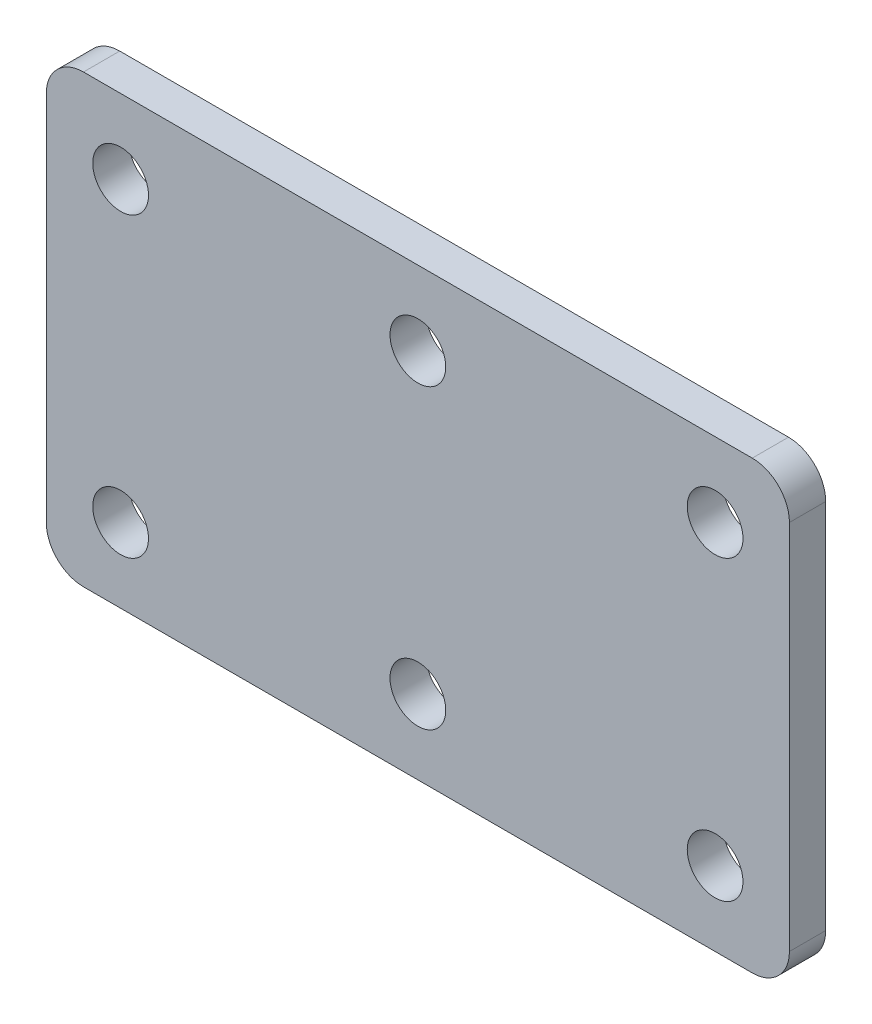
ISO-10303-21;
HEADER;
FILE_DESCRIPTION(('STEP AP214'),'2;1');
FILE_NAME('part.step','',(''),(''),'','','');
FILE_SCHEMA(('AUTOMOTIVE_DESIGN { 1 0 10303 214 1 1 1 1 }'));
ENDSEC;
DATA;
#1=APPLICATION_CONTEXT('core data for automotive mechanical design processes');
#2=APPLICATION_PROTOCOL_DEFINITION('international standard','automotive_design',2000,#1);
#3=PRODUCT_CONTEXT('',#1,'mechanical');
#4=PRODUCT('Part','Part','',(#3));
#5=PRODUCT_RELATED_PRODUCT_CATEGORY('part','',(#4));
#6=PRODUCT_DEFINITION_FORMATION('','',#4);
#7=PRODUCT_DEFINITION_CONTEXT('part definition',#1,'design');
#8=PRODUCT_DEFINITION('design','',#6,#7);
#9=PRODUCT_DEFINITION_SHAPE('','',#8);
#10=(LENGTH_UNIT() NAMED_UNIT(*) SI_UNIT(.MILLI.,.METRE.));
#11=(NAMED_UNIT(*) PLANE_ANGLE_UNIT() SI_UNIT($,.RADIAN.));
#12=(NAMED_UNIT(*) SI_UNIT($,.STERADIAN.) SOLID_ANGLE_UNIT());
#13=UNCERTAINTY_MEASURE_WITH_UNIT(LENGTH_MEASURE(1.E-05),#10,'distance_accuracy_value','');
#14=(GEOMETRIC_REPRESENTATION_CONTEXT(3) GLOBAL_UNCERTAINTY_ASSIGNED_CONTEXT((#13)) GLOBAL_UNIT_ASSIGNED_CONTEXT((#10,
#11,#12)) REPRESENTATION_CONTEXT('',''));
#15=CARTESIAN_POINT('',(0.,0.,0.));
#16=DIRECTION('',(0.,0.,1.));
#17=DIRECTION('',(1.,0.,0.));
#18=AXIS2_PLACEMENT_3D('',#15,#16,#17);
#19=CARTESIAN_POINT('',(0.,0.,3.0988));
#20=DIRECTION('',(0.,0.,1.));
#21=DIRECTION('',(1.,0.,0.));
#22=AXIS2_PLACEMENT_3D('',#19,#20,#21);
#23=PLANE('',#22);
#24=CARTESIAN_POINT('',(-25.4,-12.7,3.0988));
#25=DIRECTION('',(0.,0.,1.));
#26=DIRECTION('',(-1.,0.,0.));
#27=AXIS2_PLACEMENT_3D('',#24,#25,#26);
#28=CIRCLE('',#27,2.38125);
#29=CARTESIAN_POINT('',(-27.78125,-12.7,3.0988));
#30=VERTEX_POINT('',#29);
#31=EDGE_CURVE('E174',#30,#30,#28,.T.);
#32=ORIENTED_EDGE('',*,*,#31,.F.);
#33=EDGE_LOOP('',(#32));
#34=FACE_BOUND('',#33,.T.);
#35=CARTESIAN_POINT('',(25.3999999999999,-12.7,3.0988));
#36=DIRECTION('',(0.,0.,1.));
#37=DIRECTION('',(-1.,0.,0.));
#38=AXIS2_PLACEMENT_3D('',#35,#36,#37);
#39=CIRCLE('',#38,2.38125);
#40=CARTESIAN_POINT('',(23.0187499999999,-12.7,3.0988));
#41=VERTEX_POINT('',#40);
#42=EDGE_CURVE('E187',#41,#41,#39,.T.);
#43=ORIENTED_EDGE('',*,*,#42,.F.);
#44=EDGE_LOOP('',(#43));
#45=FACE_BOUND('',#44,.T.);
#46=CARTESIAN_POINT('',(0.,12.7,3.0988));
#47=DIRECTION('',(0.,0.,1.));
#48=DIRECTION('',(1.,0.,0.));
#49=AXIS2_PLACEMENT_3D('',#46,#47,#48);
#50=CIRCLE('',#49,2.38125);
#51=CARTESIAN_POINT('',(2.38125000000001,12.7,3.0988));
#52=VERTEX_POINT('',#51);
#53=EDGE_CURVE('E199',#52,#52,#50,.T.);
#54=ORIENTED_EDGE('',*,*,#53,.F.);
#55=EDGE_LOOP('',(#54));
#56=FACE_BOUND('',#55,.T.);
#57=CARTESIAN_POINT('',(-25.4,12.7,3.0988));
#58=DIRECTION('',(0.,0.,1.));
#59=DIRECTION('',(1.,0.,0.));
#60=AXIS2_PLACEMENT_3D('',#57,#58,#59);
#61=CIRCLE('',#60,2.38125);
#62=CARTESIAN_POINT('',(-23.01875,12.7,3.0988));
#63=VERTEX_POINT('',#62);
#64=EDGE_CURVE('E126',#63,#63,#61,.T.);
#65=ORIENTED_EDGE('',*,*,#64,.F.);
#66=EDGE_LOOP('',(#65));
#67=FACE_BOUND('',#66,.T.);
#68=CARTESIAN_POINT('',(25.4,12.7,3.0988));
#69=DIRECTION('',(0.,0.,1.));
#70=DIRECTION('',(1.,0.,0.));
#71=AXIS2_PLACEMENT_3D('',#68,#69,#70);
#72=CIRCLE('',#71,2.38125);
#73=CARTESIAN_POINT('',(27.78125,12.7,3.0988));
#74=VERTEX_POINT('',#73);
#75=EDGE_CURVE('E193',#74,#74,#72,.T.);
#76=ORIENTED_EDGE('',*,*,#75,.F.);
#77=EDGE_LOOP('',(#76));
#78=FACE_BOUND('',#77,.T.);
#79=CARTESIAN_POINT('',(0.,-12.7,3.0988));
#80=DIRECTION('',(0.,0.,1.));
#81=DIRECTION('',(-1.,0.,0.));
#82=AXIS2_PLACEMENT_3D('',#79,#80,#81);
#83=CIRCLE('',#82,2.38125);
#84=CARTESIAN_POINT('',(-2.38125000000002,-12.7,3.0988));
#85=VERTEX_POINT('',#84);
#86=EDGE_CURVE('E181',#85,#85,#83,.T.);
#87=ORIENTED_EDGE('',*,*,#86,.F.);
#88=EDGE_LOOP('',(#87));
#89=FACE_BOUND('',#88,.T.);
#90=DIRECTION('',(1.,0.,0.));
#91=VECTOR('',#90,1.);
#92=CARTESIAN_POINT('',(-31.75,-19.05,3.0988));
#93=LINE('',#92,#91);
#94=CARTESIAN_POINT('',(-28.575,-19.05,3.0988));
#95=VERTEX_POINT('',#94);
#96=CARTESIAN_POINT('',(28.575,-19.05,3.0988));
#97=VERTEX_POINT('',#96);
#98=EDGE_CURVE('E104',#95,#97,#93,.T.);
#99=ORIENTED_EDGE('',*,*,#98,.T.);
#100=CARTESIAN_POINT('',(28.575,-15.875,3.0988));
#101=DIRECTION('',(0.,0.,1.));
#102=DIRECTION('',(1.,0.,0.));
#103=AXIS2_PLACEMENT_3D('',#100,#101,#102);
#104=CIRCLE('',#103,3.175);
#105=CARTESIAN_POINT('',(31.75,-15.875,3.0988));
#106=VERTEX_POINT('',#105);
#107=EDGE_CURVE('E136',#97,#106,#104,.T.);
#108=ORIENTED_EDGE('',*,*,#107,.T.);
#109=DIRECTION('',(0.,1.,0.));
#110=VECTOR('',#109,1.);
#111=CARTESIAN_POINT('',(31.75,-19.05,3.0988));
#112=LINE('',#111,#110);
#113=CARTESIAN_POINT('',(31.75,15.875,3.0988));
#114=VERTEX_POINT('',#113);
#115=EDGE_CURVE('E168',#106,#114,#112,.T.);
#116=ORIENTED_EDGE('',*,*,#115,.T.);
#117=CARTESIAN_POINT('',(28.575,15.875,3.0988));
#118=DIRECTION('',(0.,0.,1.));
#119=DIRECTION('',(1.,0.,0.));
#120=AXIS2_PLACEMENT_3D('',#117,#118,#119);
#121=CIRCLE('',#120,3.175);
#122=CARTESIAN_POINT('',(28.575,19.05,3.0988));
#123=VERTEX_POINT('',#122);
#124=EDGE_CURVE('E110',#114,#123,#121,.T.);
#125=ORIENTED_EDGE('',*,*,#124,.T.);
#126=DIRECTION('',(-1.,0.,0.));
#127=VECTOR('',#126,1.);
#128=CARTESIAN_POINT('',(31.75,19.05,3.0988));
#129=LINE('',#128,#127);
#130=CARTESIAN_POINT('',(-28.575,19.05,3.0988));
#131=VERTEX_POINT('',#130);
#132=EDGE_CURVE('E166',#123,#131,#129,.T.);
#133=ORIENTED_EDGE('',*,*,#132,.T.);
#134=CARTESIAN_POINT('',(-28.575,15.875,3.0988));
#135=DIRECTION('',(0.,0.,1.));
#136=DIRECTION('',(1.,0.,0.));
#137=AXIS2_PLACEMENT_3D('',#134,#135,#136);
#138=CIRCLE('',#137,3.175);
#139=CARTESIAN_POINT('',(-31.75,15.875,3.0988));
#140=VERTEX_POINT('',#139);
#141=EDGE_CURVE('E111',#131,#140,#138,.T.);
#142=ORIENTED_EDGE('',*,*,#141,.T.);
#143=DIRECTION('',(0.,-1.,0.));
#144=VECTOR('',#143,1.);
#145=CARTESIAN_POINT('',(-31.75,19.05,3.0988));
#146=LINE('',#145,#144);
#147=CARTESIAN_POINT('',(-31.75,-15.875,3.0988));
#148=VERTEX_POINT('',#147);
#149=EDGE_CURVE('E106',#140,#148,#146,.T.);
#150=ORIENTED_EDGE('',*,*,#149,.T.);
#151=CARTESIAN_POINT('',(-28.575,-15.875,3.0988));
#152=DIRECTION('',(0.,0.,1.));
#153=DIRECTION('',(1.,0.,0.));
#154=AXIS2_PLACEMENT_3D('',#151,#152,#153);
#155=CIRCLE('',#154,3.175);
#156=EDGE_CURVE('E102',#148,#95,#155,.T.);
#157=ORIENTED_EDGE('',*,*,#156,.T.);
#158=EDGE_LOOP('',(#99,#108,#116,#125,#133,#142,#150,#157));
#159=FACE_BOUND('',#158,.T.);
#160=ADVANCED_FACE('F35',(#34,#45,#56,#67,#78,#89,#159),#23,.T.);
#161=CARTESIAN_POINT('',(0.,0.,0.));
#162=DIRECTION('',(0.,0.,1.));
#163=DIRECTION('',(1.,0.,0.));
#164=AXIS2_PLACEMENT_3D('',#161,#162,#163);
#165=PLANE('',#164);
#166=CARTESIAN_POINT('',(-25.4,-12.7,0.));
#167=DIRECTION('',(0.,0.,1.));
#168=DIRECTION('',(-1.,0.,0.));
#169=AXIS2_PLACEMENT_3D('',#166,#167,#168);
#170=CIRCLE('',#169,2.38125);
#171=CARTESIAN_POINT('',(-27.78125,-12.7,0.));
#172=VERTEX_POINT('',#171);
#173=EDGE_CURVE('E178',#172,#172,#170,.T.);
#174=ORIENTED_EDGE('',*,*,#173,.T.);
#175=EDGE_LOOP('',(#174));
#176=FACE_BOUND('',#175,.T.);
#177=CARTESIAN_POINT('',(0.,-12.7,0.));
#178=DIRECTION('',(0.,0.,1.));
#179=DIRECTION('',(-1.,0.,0.));
#180=AXIS2_PLACEMENT_3D('',#177,#178,#179);
#181=CIRCLE('',#180,2.38125);
#182=CARTESIAN_POINT('',(-2.38125000000002,-12.7,0.));
#183=VERTEX_POINT('',#182);
#184=EDGE_CURVE('E177',#183,#183,#181,.T.);
#185=ORIENTED_EDGE('',*,*,#184,.T.);
#186=EDGE_LOOP('',(#185));
#187=FACE_BOUND('',#186,.T.);
#188=CARTESIAN_POINT('',(25.3999999999999,-12.7,0.));
#189=DIRECTION('',(0.,0.,1.));
#190=DIRECTION('',(-1.,0.,0.));
#191=AXIS2_PLACEMENT_3D('',#188,#189,#190);
#192=CIRCLE('',#191,2.38125);
#193=CARTESIAN_POINT('',(23.0187499999999,-12.7,0.));
#194=VERTEX_POINT('',#193);
#195=EDGE_CURVE('E184',#194,#194,#192,.T.);
#196=ORIENTED_EDGE('',*,*,#195,.T.);
#197=EDGE_LOOP('',(#196));
#198=FACE_BOUND('',#197,.T.);
#199=CARTESIAN_POINT('',(25.4,12.7,0.));
#200=DIRECTION('',(0.,0.,1.));
#201=DIRECTION('',(1.,0.,0.));
#202=AXIS2_PLACEMENT_3D('',#199,#200,#201);
#203=CIRCLE('',#202,2.38125);
#204=CARTESIAN_POINT('',(27.78125,12.7,0.));
#205=VERTEX_POINT('',#204);
#206=EDGE_CURVE('E190',#205,#205,#203,.T.);
#207=ORIENTED_EDGE('',*,*,#206,.T.);
#208=EDGE_LOOP('',(#207));
#209=FACE_BOUND('',#208,.T.);
#210=CARTESIAN_POINT('',(0.,12.7,0.));
#211=DIRECTION('',(0.,0.,1.));
#212=DIRECTION('',(1.,0.,0.));
#213=AXIS2_PLACEMENT_3D('',#210,#211,#212);
#214=CIRCLE('',#213,2.38125);
#215=CARTESIAN_POINT('',(2.38125000000001,12.7,0.));
#216=VERTEX_POINT('',#215);
#217=EDGE_CURVE('E196',#216,#216,#214,.T.);
#218=ORIENTED_EDGE('',*,*,#217,.T.);
#219=EDGE_LOOP('',(#218));
#220=FACE_BOUND('',#219,.T.);
#221=CARTESIAN_POINT('',(-25.4,12.7,0.));
#222=DIRECTION('',(0.,0.,1.));
#223=DIRECTION('',(1.,0.,0.));
#224=AXIS2_PLACEMENT_3D('',#221,#222,#223);
#225=CIRCLE('',#224,2.38125);
#226=CARTESIAN_POINT('',(-23.01875,12.7,0.));
#227=VERTEX_POINT('',#226);
#228=EDGE_CURVE('E130',#227,#227,#225,.T.);
#229=ORIENTED_EDGE('',*,*,#228,.T.);
#230=EDGE_LOOP('',(#229));
#231=FACE_BOUND('',#230,.T.);
#232=DIRECTION('',(0.,1.,0.));
#233=VECTOR('',#232,1.);
#234=CARTESIAN_POINT('',(31.75,-19.05,0.));
#235=LINE('',#234,#233);
#236=CARTESIAN_POINT('',(31.75,-15.875,0.));
#237=VERTEX_POINT('',#236);
#238=CARTESIAN_POINT('',(31.75,15.875,0.));
#239=VERTEX_POINT('',#238);
#240=EDGE_CURVE('E121',#237,#239,#235,.T.);
#241=ORIENTED_EDGE('',*,*,#240,.F.);
#242=CARTESIAN_POINT('',(28.575,-15.875,0.));
#243=DIRECTION('',(0.,0.,1.));
#244=DIRECTION('',(1.,0.,0.));
#245=AXIS2_PLACEMENT_3D('',#242,#243,#244);
#246=CIRCLE('',#245,3.175);
#247=CARTESIAN_POINT('',(28.575,-19.05,0.));
#248=VERTEX_POINT('',#247);
#249=EDGE_CURVE('E147',#237,#248,#246,.F.);
#250=ORIENTED_EDGE('',*,*,#249,.T.);
#251=DIRECTION('',(1.,0.,0.));
#252=VECTOR('',#251,1.);
#253=CARTESIAN_POINT('',(-31.75,-19.05,0.));
#254=LINE('',#253,#252);
#255=CARTESIAN_POINT('',(-28.575,-19.05,0.));
#256=VERTEX_POINT('',#255);
#257=EDGE_CURVE('E160',#256,#248,#254,.T.);
#258=ORIENTED_EDGE('',*,*,#257,.F.);
#259=CARTESIAN_POINT('',(-28.575,-15.875,0.));
#260=DIRECTION('',(0.,0.,1.));
#261=DIRECTION('',(1.,0.,0.));
#262=AXIS2_PLACEMENT_3D('',#259,#260,#261);
#263=CIRCLE('',#262,3.175);
#264=CARTESIAN_POINT('',(-31.75,-15.875,0.));
#265=VERTEX_POINT('',#264);
#266=EDGE_CURVE('E125',#256,#265,#263,.F.);
#267=ORIENTED_EDGE('',*,*,#266,.T.);
#268=DIRECTION('',(0.,-1.,0.));
#269=VECTOR('',#268,1.);
#270=CARTESIAN_POINT('',(-31.75,19.05,0.));
#271=LINE('',#270,#269);
#272=CARTESIAN_POINT('',(-31.75,15.875,0.));
#273=VERTEX_POINT('',#272);
#274=EDGE_CURVE('E156',#273,#265,#271,.T.);
#275=ORIENTED_EDGE('',*,*,#274,.F.);
#276=CARTESIAN_POINT('',(-28.575,15.875,0.));
#277=DIRECTION('',(0.,0.,1.));
#278=DIRECTION('',(1.,0.,0.));
#279=AXIS2_PLACEMENT_3D('',#276,#277,#278);
#280=CIRCLE('',#279,3.175);
#281=CARTESIAN_POINT('',(-28.575,19.05,0.));
#282=VERTEX_POINT('',#281);
#283=EDGE_CURVE('E50',#273,#282,#280,.F.);
#284=ORIENTED_EDGE('',*,*,#283,.T.);
#285=DIRECTION('',(-1.,0.,0.));
#286=VECTOR('',#285,1.);
#287=CARTESIAN_POINT('',(31.75,19.05,0.));
#288=LINE('',#287,#286);
#289=CARTESIAN_POINT('',(28.575,19.05,0.));
#290=VERTEX_POINT('',#289);
#291=EDGE_CURVE('E161',#290,#282,#288,.T.);
#292=ORIENTED_EDGE('',*,*,#291,.F.);
#293=CARTESIAN_POINT('',(28.575,15.875,0.));
#294=DIRECTION('',(0.,0.,1.));
#295=DIRECTION('',(1.,0.,0.));
#296=AXIS2_PLACEMENT_3D('',#293,#294,#295);
#297=CIRCLE('',#296,3.175);
#298=EDGE_CURVE('E145',#290,#239,#297,.F.);
#299=ORIENTED_EDGE('',*,*,#298,.T.);
#300=EDGE_LOOP('',(#241,#250,#258,#267,#275,#284,#292,#299));
#301=FACE_BOUND('',#300,.T.);
#302=ADVANCED_FACE('F159',(#176,#187,#198,#209,#220,#231,#301),#165,.F.);
#303=CARTESIAN_POINT('',(-25.4,12.7,3.0988));
#304=DIRECTION('',(0.,0.,-1.));
#305=DIRECTION('',(-1.,0.,0.));
#306=AXIS2_PLACEMENT_3D('',#303,#304,#305);
#307=CYLINDRICAL_SURFACE('',#306,2.38125);
#308=ORIENTED_EDGE('',*,*,#64,.T.);
#309=EDGE_LOOP('',(#308));
#310=FACE_BOUND('',#309,.T.);
#311=ORIENTED_EDGE('',*,*,#228,.F.);
#312=EDGE_LOOP('',(#311));
#313=FACE_BOUND('',#312,.T.);
#314=ADVANCED_FACE('F210',(#310,#313),#307,.F.);
#315=CARTESIAN_POINT('',(0.,12.7,3.0988));
#316=DIRECTION('',(0.,0.,-1.));
#317=DIRECTION('',(-1.,0.,0.));
#318=AXIS2_PLACEMENT_3D('',#315,#316,#317);
#319=CYLINDRICAL_SURFACE('',#318,2.38125);
#320=ORIENTED_EDGE('',*,*,#53,.T.);
#321=EDGE_LOOP('',(#320));
#322=FACE_BOUND('',#321,.T.);
#323=ORIENTED_EDGE('',*,*,#217,.F.);
#324=EDGE_LOOP('',(#323));
#325=FACE_BOUND('',#324,.T.);
#326=ADVANCED_FACE('F207',(#322,#325),#319,.F.);
#327=CARTESIAN_POINT('',(25.4,12.7,3.0988));
#328=DIRECTION('',(0.,0.,-1.));
#329=DIRECTION('',(-1.,0.,0.));
#330=AXIS2_PLACEMENT_3D('',#327,#328,#329);
#331=CYLINDRICAL_SURFACE('',#330,2.38125);
#332=ORIENTED_EDGE('',*,*,#75,.T.);
#333=EDGE_LOOP('',(#332));
#334=FACE_BOUND('',#333,.T.);
#335=ORIENTED_EDGE('',*,*,#206,.F.);
#336=EDGE_LOOP('',(#335));
#337=FACE_BOUND('',#336,.T.);
#338=ADVANCED_FACE('F209',(#334,#337),#331,.F.);
#339=CARTESIAN_POINT('',(25.3999999999999,-12.7,3.0988));
#340=DIRECTION('',(0.,0.,-1.));
#341=DIRECTION('',(-1.,0.,0.));
#342=AXIS2_PLACEMENT_3D('',#339,#340,#341);
#343=CYLINDRICAL_SURFACE('',#342,2.38125);
#344=ORIENTED_EDGE('',*,*,#42,.T.);
#345=EDGE_LOOP('',(#344));
#346=FACE_BOUND('',#345,.T.);
#347=ORIENTED_EDGE('',*,*,#195,.F.);
#348=EDGE_LOOP('',(#347));
#349=FACE_BOUND('',#348,.T.);
#350=ADVANCED_FACE('F217',(#346,#349),#343,.F.);
#351=CARTESIAN_POINT('',(0.,-12.7,3.0988));
#352=DIRECTION('',(0.,0.,-1.));
#353=DIRECTION('',(-1.,0.,0.));
#354=AXIS2_PLACEMENT_3D('',#351,#352,#353);
#355=CYLINDRICAL_SURFACE('',#354,2.38125);
#356=ORIENTED_EDGE('',*,*,#86,.T.);
#357=EDGE_LOOP('',(#356));
#358=FACE_BOUND('',#357,.T.);
#359=ORIENTED_EDGE('',*,*,#184,.F.);
#360=EDGE_LOOP('',(#359));
#361=FACE_BOUND('',#360,.T.);
#362=ADVANCED_FACE('F308',(#358,#361),#355,.F.);
#363=CARTESIAN_POINT('',(-25.4,-12.7,3.0988));
#364=DIRECTION('',(0.,0.,-1.));
#365=DIRECTION('',(-1.,0.,0.));
#366=AXIS2_PLACEMENT_3D('',#363,#364,#365);
#367=CYLINDRICAL_SURFACE('',#366,2.38125);
#368=ORIENTED_EDGE('',*,*,#31,.T.);
#369=EDGE_LOOP('',(#368));
#370=FACE_BOUND('',#369,.T.);
#371=ORIENTED_EDGE('',*,*,#173,.F.);
#372=EDGE_LOOP('',(#371));
#373=FACE_BOUND('',#372,.T.);
#374=ADVANCED_FACE('F289',(#370,#373),#367,.F.);
#375=CARTESIAN_POINT('',(31.75,-19.05,0.));
#376=DIRECTION('',(1.,0.,0.));
#377=DIRECTION('',(0.,0.,-1.));
#378=AXIS2_PLACEMENT_3D('',#375,#376,#377);
#379=PLANE('',#378);
#380=ORIENTED_EDGE('',*,*,#115,.F.);
#381=DIRECTION('',(0.,0.,1.));
#382=VECTOR('',#381,1.);
#383=CARTESIAN_POINT('',(31.75,-15.875,0.));
#384=LINE('',#383,#382);
#385=EDGE_CURVE('E141',#106,#237,#384,.F.);
#386=ORIENTED_EDGE('',*,*,#385,.T.);
#387=ORIENTED_EDGE('',*,*,#240,.T.);
#388=DIRECTION('',(0.,0.,1.));
#389=VECTOR('',#388,1.);
#390=CARTESIAN_POINT('',(31.75,15.875,0.));
#391=LINE('',#390,#389);
#392=EDGE_CURVE('E138',#239,#114,#391,.T.);
#393=ORIENTED_EDGE('',*,*,#392,.T.);
#394=EDGE_LOOP('',(#380,#386,#387,#393));
#395=FACE_BOUND('',#394,.T.);
#396=ADVANCED_FACE('F282',(#395),#379,.T.);
#397=CARTESIAN_POINT('',(-31.75,-19.05,0.));
#398=DIRECTION('',(0.,-1.,0.));
#399=DIRECTION('',(0.,0.,-1.));
#400=AXIS2_PLACEMENT_3D('',#397,#398,#399);
#401=PLANE('',#400);
#402=ORIENTED_EDGE('',*,*,#257,.T.);
#403=DIRECTION('',(0.,0.,1.));
#404=VECTOR('',#403,1.);
#405=CARTESIAN_POINT('',(28.575,-19.05,0.));
#406=LINE('',#405,#404);
#407=EDGE_CURVE('E120',#248,#97,#406,.T.);
#408=ORIENTED_EDGE('',*,*,#407,.T.);
#409=ORIENTED_EDGE('',*,*,#98,.F.);
#410=DIRECTION('',(0.,0.,1.));
#411=VECTOR('',#410,1.);
#412=CARTESIAN_POINT('',(-28.575,-19.05,0.));
#413=LINE('',#412,#411);
#414=EDGE_CURVE('E117',#95,#256,#413,.F.);
#415=ORIENTED_EDGE('',*,*,#414,.T.);
#416=EDGE_LOOP('',(#402,#408,#409,#415));
#417=FACE_BOUND('',#416,.T.);
#418=ADVANCED_FACE('F116',(#417),#401,.T.);
#419=CARTESIAN_POINT('',(-31.75,19.05,0.));
#420=DIRECTION('',(-1.,0.,0.));
#421=DIRECTION('',(0.,0.,1.));
#422=AXIS2_PLACEMENT_3D('',#419,#420,#421);
#423=PLANE('',#422);
#424=ORIENTED_EDGE('',*,*,#274,.T.);
#425=DIRECTION('',(0.,0.,1.));
#426=VECTOR('',#425,1.);
#427=CARTESIAN_POINT('',(-31.75,-15.875,0.));
#428=LINE('',#427,#426);
#429=EDGE_CURVE('E11',#265,#148,#428,.T.);
#430=ORIENTED_EDGE('',*,*,#429,.T.);
#431=ORIENTED_EDGE('',*,*,#149,.F.);
#432=DIRECTION('',(0.,0.,1.));
#433=VECTOR('',#432,1.);
#434=CARTESIAN_POINT('',(-31.75,15.875,0.));
#435=LINE('',#434,#433);
#436=EDGE_CURVE('E43',#140,#273,#435,.F.);
#437=ORIENTED_EDGE('',*,*,#436,.T.);
#438=EDGE_LOOP('',(#424,#430,#431,#437));
#439=FACE_BOUND('',#438,.T.);
#440=ADVANCED_FACE('F155',(#439),#423,.T.);
#441=CARTESIAN_POINT('',(31.75,19.05,0.));
#442=DIRECTION('',(0.,1.,0.));
#443=DIRECTION('',(0.,0.,1.));
#444=AXIS2_PLACEMENT_3D('',#441,#442,#443);
#445=PLANE('',#444);
#446=ORIENTED_EDGE('',*,*,#132,.F.);
#447=DIRECTION('',(0.,0.,1.));
#448=VECTOR('',#447,1.);
#449=CARTESIAN_POINT('',(28.575,19.05,0.));
#450=LINE('',#449,#448);
#451=EDGE_CURVE('E57',#123,#290,#450,.F.);
#452=ORIENTED_EDGE('',*,*,#451,.T.);
#453=ORIENTED_EDGE('',*,*,#291,.T.);
#454=DIRECTION('',(0.,0.,1.));
#455=VECTOR('',#454,1.);
#456=CARTESIAN_POINT('',(-28.575,19.05,0.));
#457=LINE('',#456,#455);
#458=EDGE_CURVE('E149',#282,#131,#457,.T.);
#459=ORIENTED_EDGE('',*,*,#458,.T.);
#460=EDGE_LOOP('',(#446,#452,#453,#459));
#461=FACE_BOUND('',#460,.T.);
#462=ADVANCED_FACE('F165',(#461),#445,.T.);
#463=CARTESIAN_POINT('',(28.575,-15.875,0.));
#464=DIRECTION('',(0.,0.,1.));
#465=DIRECTION('',(1.,0.,0.));
#466=AXIS2_PLACEMENT_3D('',#463,#464,#465);
#467=CYLINDRICAL_SURFACE('',#466,3.175);
#468=ORIENTED_EDGE('',*,*,#249,.F.);
#469=ORIENTED_EDGE('',*,*,#385,.F.);
#470=ORIENTED_EDGE('',*,*,#107,.F.);
#471=ORIENTED_EDGE('',*,*,#407,.F.);
#472=EDGE_LOOP('',(#468,#469,#470,#471));
#473=FACE_BOUND('',#472,.T.);
#474=ADVANCED_FACE('F233',(#473),#467,.T.);
#475=CARTESIAN_POINT('',(28.575,15.875,0.));
#476=DIRECTION('',(0.,0.,1.));
#477=DIRECTION('',(1.,0.,0.));
#478=AXIS2_PLACEMENT_3D('',#475,#476,#477);
#479=CYLINDRICAL_SURFACE('',#478,3.175);
#480=ORIENTED_EDGE('',*,*,#298,.F.);
#481=ORIENTED_EDGE('',*,*,#451,.F.);
#482=ORIENTED_EDGE('',*,*,#124,.F.);
#483=ORIENTED_EDGE('',*,*,#392,.F.);
#484=EDGE_LOOP('',(#480,#481,#482,#483));
#485=FACE_BOUND('',#484,.T.);
#486=ADVANCED_FACE('F236',(#485),#479,.T.);
#487=CARTESIAN_POINT('',(-28.575,-15.875,0.));
#488=DIRECTION('',(0.,0.,1.));
#489=DIRECTION('',(1.,0.,0.));
#490=AXIS2_PLACEMENT_3D('',#487,#488,#489);
#491=CYLINDRICAL_SURFACE('',#490,3.175);
#492=ORIENTED_EDGE('',*,*,#266,.F.);
#493=ORIENTED_EDGE('',*,*,#414,.F.);
#494=ORIENTED_EDGE('',*,*,#156,.F.);
#495=ORIENTED_EDGE('',*,*,#429,.F.);
#496=EDGE_LOOP('',(#492,#493,#494,#495));
#497=FACE_BOUND('',#496,.T.);
#498=ADVANCED_FACE('F124',(#497),#491,.T.);
#499=CARTESIAN_POINT('',(-28.575,15.875,0.));
#500=DIRECTION('',(0.,0.,1.));
#501=DIRECTION('',(1.,0.,0.));
#502=AXIS2_PLACEMENT_3D('',#499,#500,#501);
#503=CYLINDRICAL_SURFACE('',#502,3.175);
#504=ORIENTED_EDGE('',*,*,#283,.F.);
#505=ORIENTED_EDGE('',*,*,#436,.F.);
#506=ORIENTED_EDGE('',*,*,#141,.F.);
#507=ORIENTED_EDGE('',*,*,#458,.F.);
#508=EDGE_LOOP('',(#504,#505,#506,#507));
#509=FACE_BOUND('',#508,.T.);
#510=ADVANCED_FACE('F37',(#509),#503,.T.);
#511=CLOSED_SHELL('',(#160,#302,#314,#326,#338,#350,#362,#374,#396,#418,#440,#462,#474,#486,
#498,#510));
#512=MANIFOLD_SOLID_BREP('B2',#511);
#513=ADVANCED_BREP_SHAPE_REPRESENTATION('',(#18,#512),#14);
#514=SHAPE_DEFINITION_REPRESENTATION(#9,#513);
ENDSEC;
END-ISO-10303-21;
